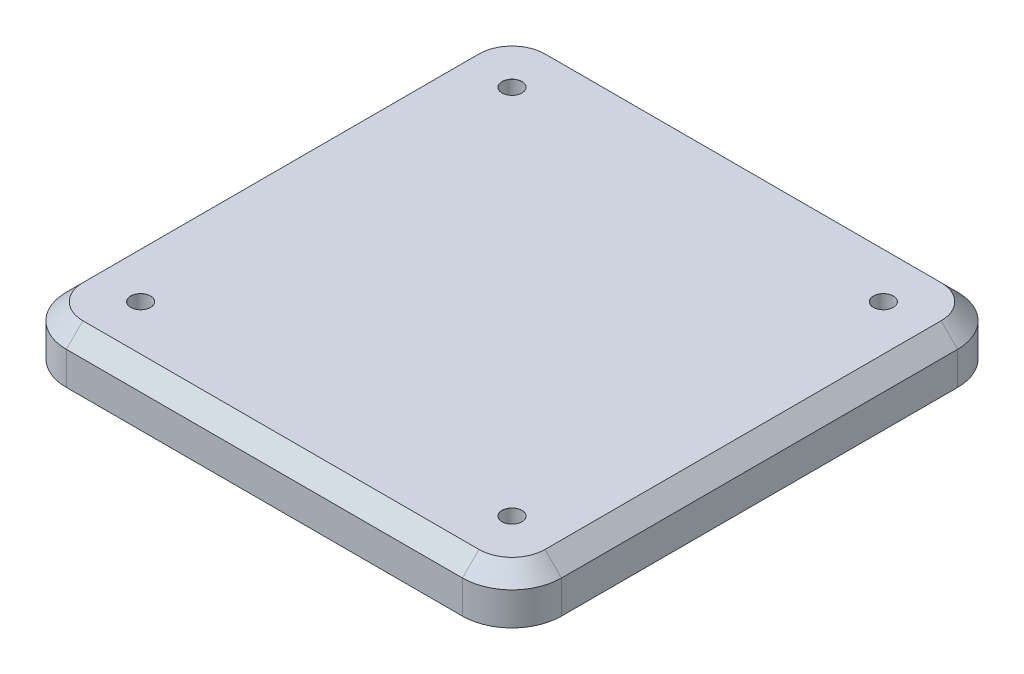
ISO-10303-21;
HEADER;
FILE_DESCRIPTION(('STEP AP214'),'2;1');
FILE_NAME('part.step','',(''),(''),'','','');
FILE_SCHEMA(('AUTOMOTIVE_DESIGN { 1 0 10303 214 1 1 1 1 }'));
ENDSEC;
DATA;
#1=APPLICATION_CONTEXT('core data for automotive mechanical design processes');
#2=APPLICATION_PROTOCOL_DEFINITION('international standard','automotive_design',2000,#1);
#3=PRODUCT_CONTEXT('',#1,'mechanical');
#4=PRODUCT('Part','Part','',(#3));
#5=PRODUCT_RELATED_PRODUCT_CATEGORY('part','',(#4));
#6=PRODUCT_DEFINITION_FORMATION('','',#4);
#7=PRODUCT_DEFINITION_CONTEXT('part definition',#1,'design');
#8=PRODUCT_DEFINITION('design','',#6,#7);
#9=PRODUCT_DEFINITION_SHAPE('','',#8);
#10=(LENGTH_UNIT() NAMED_UNIT(*) SI_UNIT(.MILLI.,.METRE.));
#11=(NAMED_UNIT(*) PLANE_ANGLE_UNIT() SI_UNIT($,.RADIAN.));
#12=(NAMED_UNIT(*) SI_UNIT($,.STERADIAN.) SOLID_ANGLE_UNIT());
#13=UNCERTAINTY_MEASURE_WITH_UNIT(LENGTH_MEASURE(1.E-05),#10,'distance_accuracy_value','');
#14=(GEOMETRIC_REPRESENTATION_CONTEXT(3) GLOBAL_UNCERTAINTY_ASSIGNED_CONTEXT((#13)) GLOBAL_UNIT_ASSIGNED_CONTEXT((#10,
#11,#12)) REPRESENTATION_CONTEXT('',''));
#15=CARTESIAN_POINT('',(0.,0.,0.));
#16=DIRECTION('',(0.,0.,1.));
#17=DIRECTION('',(1.,0.,0.));
#18=AXIS2_PLACEMENT_3D('',#15,#16,#17);
#19=CARTESIAN_POINT('',(150.,30.,-150.));
#20=DIRECTION('',(-1.,0.,0.));
#21=DIRECTION('',(0.,0.,1.));
#22=AXIS2_PLACEMENT_3D('',#19,#20,#21);
#23=PLANE('',#22);
#24=DIRECTION('',(0.,-1.,0.));
#25=VECTOR('',#24,1.);
#26=CARTESIAN_POINT('',(150.,30.,-120.));
#27=LINE('',#26,#25);
#28=CARTESIAN_POINT('',(150.,0.,-120.));
#29=VERTEX_POINT('',#28);
#30=CARTESIAN_POINT('',(150.,20.,-120.));
#31=VERTEX_POINT('',#30);
#32=EDGE_CURVE('E275',#29,#31,#27,.F.);
#33=ORIENTED_EDGE('',*,*,#32,.T.);
#34=DIRECTION('',(0.,0.,1.));
#35=VECTOR('',#34,1.);
#36=CARTESIAN_POINT('',(150.,20.,120.));
#37=LINE('',#36,#35);
#38=CARTESIAN_POINT('',(150.,20.,120.));
#39=VERTEX_POINT('',#38);
#40=EDGE_CURVE('E67',#31,#39,#37,.T.);
#41=ORIENTED_EDGE('',*,*,#40,.T.);
#42=DIRECTION('',(0.,-1.,0.));
#43=VECTOR('',#42,1.);
#44=CARTESIAN_POINT('',(150.,30.,120.));
#45=LINE('',#44,#43);
#46=CARTESIAN_POINT('',(150.,0.,120.));
#47=VERTEX_POINT('',#46);
#48=EDGE_CURVE('E278',#39,#47,#45,.T.);
#49=ORIENTED_EDGE('',*,*,#48,.T.);
#50=DIRECTION('',(0.,0.,-1.));
#51=VECTOR('',#50,1.);
#52=CARTESIAN_POINT('',(150.,0.,-150.));
#53=LINE('',#52,#51);
#54=EDGE_CURVE('E259',#47,#29,#53,.T.);
#55=ORIENTED_EDGE('',*,*,#54,.T.);
#56=EDGE_LOOP('',(#33,#41,#49,#55));
#57=FACE_BOUND('',#56,.T.);
#58=ADVANCED_FACE('F41',(#57),#23,.F.);
#59=CARTESIAN_POINT('',(-150.,30.,-150.));
#60=DIRECTION('',(0.,0.,1.));
#61=DIRECTION('',(1.,0.,0.));
#62=AXIS2_PLACEMENT_3D('',#59,#60,#61);
#63=PLANE('',#62);
#64=DIRECTION('',(0.,-1.,0.));
#65=VECTOR('',#64,1.);
#66=CARTESIAN_POINT('',(-120.,30.,-150.));
#67=LINE('',#66,#65);
#68=CARTESIAN_POINT('',(-120.,0.,-150.));
#69=VERTEX_POINT('',#68);
#70=CARTESIAN_POINT('',(-120.,20.,-150.));
#71=VERTEX_POINT('',#70);
#72=EDGE_CURVE('E309',#69,#71,#67,.F.);
#73=ORIENTED_EDGE('',*,*,#72,.T.);
#74=DIRECTION('',(1.,0.,0.));
#75=VECTOR('',#74,1.);
#76=CARTESIAN_POINT('',(120.,20.,-150.));
#77=LINE('',#76,#75);
#78=CARTESIAN_POINT('',(120.,20.,-150.));
#79=VERTEX_POINT('',#78);
#80=EDGE_CURVE('E348',#71,#79,#77,.T.);
#81=ORIENTED_EDGE('',*,*,#80,.T.);
#82=DIRECTION('',(0.,-1.,0.));
#83=VECTOR('',#82,1.);
#84=CARTESIAN_POINT('',(120.,30.,-150.));
#85=LINE('',#84,#83);
#86=CARTESIAN_POINT('',(120.,0.,-150.));
#87=VERTEX_POINT('',#86);
#88=EDGE_CURVE('E306',#79,#87,#85,.T.);
#89=ORIENTED_EDGE('',*,*,#88,.T.);
#90=DIRECTION('',(-1.,0.,0.));
#91=VECTOR('',#90,1.);
#92=CARTESIAN_POINT('',(-150.,0.,-150.));
#93=LINE('',#92,#91);
#94=EDGE_CURVE('E263',#87,#69,#93,.T.);
#95=ORIENTED_EDGE('',*,*,#94,.T.);
#96=EDGE_LOOP('',(#73,#81,#89,#95));
#97=FACE_BOUND('',#96,.T.);
#98=ADVANCED_FACE('F464',(#97),#63,.F.);
#99=CARTESIAN_POINT('',(-150.,30.,-150.));
#100=DIRECTION('',(1.,0.,0.));
#101=DIRECTION('',(0.,0.,-1.));
#102=AXIS2_PLACEMENT_3D('',#99,#100,#101);
#103=PLANE('',#102);
#104=DIRECTION('',(0.,-1.,0.));
#105=VECTOR('',#104,1.);
#106=CARTESIAN_POINT('',(-150.,30.,120.));
#107=LINE('',#106,#105);
#108=CARTESIAN_POINT('',(-150.,0.,120.));
#109=VERTEX_POINT('',#108);
#110=CARTESIAN_POINT('',(-150.,20.,120.));
#111=VERTEX_POINT('',#110);
#112=EDGE_CURVE('E299',#109,#111,#107,.F.);
#113=ORIENTED_EDGE('',*,*,#112,.T.);
#114=DIRECTION('',(0.,0.,-1.));
#115=VECTOR('',#114,1.);
#116=CARTESIAN_POINT('',(-150.,20.,-120.));
#117=LINE('',#116,#115);
#118=CARTESIAN_POINT('',(-150.,20.,-120.));
#119=VERTEX_POINT('',#118);
#120=EDGE_CURVE('E342',#111,#119,#117,.T.);
#121=ORIENTED_EDGE('',*,*,#120,.T.);
#122=DIRECTION('',(0.,-1.,0.));
#123=VECTOR('',#122,1.);
#124=CARTESIAN_POINT('',(-150.,30.,-120.));
#125=LINE('',#124,#123);
#126=CARTESIAN_POINT('',(-150.,0.,-120.));
#127=VERTEX_POINT('',#126);
#128=EDGE_CURVE('E303',#119,#127,#125,.T.);
#129=ORIENTED_EDGE('',*,*,#128,.T.);
#130=DIRECTION('',(0.,0.,1.));
#131=VECTOR('',#130,1.);
#132=CARTESIAN_POINT('',(-150.,0.,-150.));
#133=LINE('',#132,#131);
#134=EDGE_CURVE('E267',#127,#109,#133,.T.);
#135=ORIENTED_EDGE('',*,*,#134,.T.);
#136=EDGE_LOOP('',(#113,#121,#129,#135));
#137=FACE_BOUND('',#136,.T.);
#138=ADVANCED_FACE('F451',(#137),#103,.F.);
#139=CARTESIAN_POINT('',(-150.,30.,150.));
#140=DIRECTION('',(0.,0.,-1.));
#141=DIRECTION('',(-1.,0.,0.));
#142=AXIS2_PLACEMENT_3D('',#139,#140,#141);
#143=PLANE('',#142);
#144=DIRECTION('',(0.,-1.,0.));
#145=VECTOR('',#144,1.);
#146=CARTESIAN_POINT('',(120.,30.,150.));
#147=LINE('',#146,#145);
#148=CARTESIAN_POINT('',(120.,0.,150.));
#149=VERTEX_POINT('',#148);
#150=CARTESIAN_POINT('',(120.,20.,150.));
#151=VERTEX_POINT('',#150);
#152=EDGE_CURVE('E296',#149,#151,#147,.F.);
#153=ORIENTED_EDGE('',*,*,#152,.T.);
#154=DIRECTION('',(-1.,0.,0.));
#155=VECTOR('',#154,1.);
#156=CARTESIAN_POINT('',(-120.,20.,150.));
#157=LINE('',#156,#155);
#158=CARTESIAN_POINT('',(-120.,20.,150.));
#159=VERTEX_POINT('',#158);
#160=EDGE_CURVE('E11',#151,#159,#157,.T.);
#161=ORIENTED_EDGE('',*,*,#160,.T.);
#162=DIRECTION('',(0.,-1.,0.));
#163=VECTOR('',#162,1.);
#164=CARTESIAN_POINT('',(-120.,30.,150.));
#165=LINE('',#164,#163);
#166=CARTESIAN_POINT('',(-120.,0.,150.));
#167=VERTEX_POINT('',#166);
#168=EDGE_CURVE('E293',#159,#167,#165,.T.);
#169=ORIENTED_EDGE('',*,*,#168,.T.);
#170=DIRECTION('',(1.,0.,0.));
#171=VECTOR('',#170,1.);
#172=CARTESIAN_POINT('',(-150.,0.,150.));
#173=LINE('',#172,#171);
#174=EDGE_CURVE('E271',#167,#149,#173,.T.);
#175=ORIENTED_EDGE('',*,*,#174,.T.);
#176=EDGE_LOOP('',(#153,#161,#169,#175));
#177=FACE_BOUND('',#176,.T.);
#178=ADVANCED_FACE('F434',(#177),#143,.F.);
#179=CARTESIAN_POINT('',(0.,30.,0.));
#180=DIRECTION('',(0.,1.,0.));
#181=DIRECTION('',(0.,0.,1.));
#182=AXIS2_PLACEMENT_3D('',#179,#180,#181);
#183=PLANE('',#182);
#184=DIRECTION('',(0.,0.,1.));
#185=VECTOR('',#184,1.);
#186=CARTESIAN_POINT('',(-140.,30.,120.));
#187=LINE('',#186,#185);
#188=CARTESIAN_POINT('',(-140.,30.,-120.));
#189=VERTEX_POINT('',#188);
#190=CARTESIAN_POINT('',(-140.,30.,120.));
#191=VERTEX_POINT('',#190);
#192=EDGE_CURVE('E331',#189,#191,#187,.T.);
#193=ORIENTED_EDGE('',*,*,#192,.T.);
#194=CARTESIAN_POINT('',(-120.,30.,120.));
#195=DIRECTION('',(0.,1.,0.));
#196=DIRECTION('',(0.,0.,1.));
#197=AXIS2_PLACEMENT_3D('',#194,#195,#196);
#198=CIRCLE('',#197,20.);
#199=CARTESIAN_POINT('',(-120.,30.,140.));
#200=VERTEX_POINT('',#199);
#201=EDGE_CURVE('E334',#191,#200,#198,.T.);
#202=ORIENTED_EDGE('',*,*,#201,.T.);
#203=DIRECTION('',(1.,0.,0.));
#204=VECTOR('',#203,1.);
#205=CARTESIAN_POINT('',(120.,30.,140.));
#206=LINE('',#205,#204);
#207=CARTESIAN_POINT('',(120.,30.,140.));
#208=VERTEX_POINT('',#207);
#209=EDGE_CURVE('E313',#200,#208,#206,.T.);
#210=ORIENTED_EDGE('',*,*,#209,.T.);
#211=CARTESIAN_POINT('',(120.,30.,120.));
#212=DIRECTION('',(0.,1.,0.));
#213=DIRECTION('',(0.,0.,1.));
#214=AXIS2_PLACEMENT_3D('',#211,#212,#213);
#215=CIRCLE('',#214,20.);
#216=CARTESIAN_POINT('',(140.,30.,120.));
#217=VERTEX_POINT('',#216);
#218=EDGE_CURVE('E316',#208,#217,#215,.T.);
#219=ORIENTED_EDGE('',*,*,#218,.T.);
#220=DIRECTION('',(0.,0.,-1.));
#221=VECTOR('',#220,1.);
#222=CARTESIAN_POINT('',(140.,30.,-120.));
#223=LINE('',#222,#221);
#224=CARTESIAN_POINT('',(140.,30.,-120.));
#225=VERTEX_POINT('',#224);
#226=EDGE_CURVE('E319',#217,#225,#223,.T.);
#227=ORIENTED_EDGE('',*,*,#226,.T.);
#228=CARTESIAN_POINT('',(120.,30.,-120.));
#229=DIRECTION('',(0.,1.,0.));
#230=DIRECTION('',(0.,0.,1.));
#231=AXIS2_PLACEMENT_3D('',#228,#229,#230);
#232=CIRCLE('',#231,20.);
#233=CARTESIAN_POINT('',(120.,30.,-140.));
#234=VERTEX_POINT('',#233);
#235=EDGE_CURVE('E322',#225,#234,#232,.T.);
#236=ORIENTED_EDGE('',*,*,#235,.T.);
#237=DIRECTION('',(-1.,0.,0.));
#238=VECTOR('',#237,1.);
#239=CARTESIAN_POINT('',(-120.,30.,-140.));
#240=LINE('',#239,#238);
#241=CARTESIAN_POINT('',(-120.,30.,-140.));
#242=VERTEX_POINT('',#241);
#243=EDGE_CURVE('E325',#234,#242,#240,.T.);
#244=ORIENTED_EDGE('',*,*,#243,.T.);
#245=CARTESIAN_POINT('',(-120.,30.,-120.));
#246=DIRECTION('',(0.,1.,0.));
#247=DIRECTION('',(0.,0.,1.));
#248=AXIS2_PLACEMENT_3D('',#245,#246,#247);
#249=CIRCLE('',#248,20.);
#250=EDGE_CURVE('E328',#242,#189,#249,.T.);
#251=ORIENTED_EDGE('',*,*,#250,.T.);
#252=EDGE_LOOP('',(#193,#202,#210,#219,#227,#236,#244,#251));
#253=FACE_BOUND('',#252,.T.);
#254=CARTESIAN_POINT('',(-112.5,30.,-112.5));
#255=DIRECTION('',(0.,1.,0.));
#256=DIRECTION('',(0.,0.,1.));
#257=AXIS2_PLACEMENT_3D('',#254,#255,#256);
#258=CIRCLE('',#257,6.025);
#259=CARTESIAN_POINT('',(-112.5,30.,-106.475));
#260=VERTEX_POINT('',#259);
#261=EDGE_CURVE('E211',#260,#260,#258,.T.);
#262=ORIENTED_EDGE('',*,*,#261,.F.);
#263=EDGE_LOOP('',(#262));
#264=FACE_BOUND('',#263,.T.);
#265=CARTESIAN_POINT('',(112.5,30.,-112.5));
#266=DIRECTION('',(0.,1.,0.));
#267=DIRECTION('',(0.,0.,1.));
#268=AXIS2_PLACEMENT_3D('',#265,#266,#267);
#269=CIRCLE('',#268,6.025);
#270=CARTESIAN_POINT('',(112.5,30.,-106.475));
#271=VERTEX_POINT('',#270);
#272=EDGE_CURVE('E223',#271,#271,#269,.T.);
#273=ORIENTED_EDGE('',*,*,#272,.F.);
#274=EDGE_LOOP('',(#273));
#275=FACE_BOUND('',#274,.T.);
#276=CARTESIAN_POINT('',(112.5,30.,112.5));
#277=DIRECTION('',(0.,1.,0.));
#278=DIRECTION('',(0.,0.,1.));
#279=AXIS2_PLACEMENT_3D('',#276,#277,#278);
#280=CIRCLE('',#279,6.025);
#281=CARTESIAN_POINT('',(112.5,30.,118.525));
#282=VERTEX_POINT('',#281);
#283=EDGE_CURVE('E235',#282,#282,#280,.T.);
#284=ORIENTED_EDGE('',*,*,#283,.F.);
#285=EDGE_LOOP('',(#284));
#286=FACE_BOUND('',#285,.T.);
#287=CARTESIAN_POINT('',(-112.5,30.,112.5));
#288=DIRECTION('',(0.,1.,0.));
#289=DIRECTION('',(0.,0.,1.));
#290=AXIS2_PLACEMENT_3D('',#287,#288,#289);
#291=CIRCLE('',#290,6.025);
#292=CARTESIAN_POINT('',(-112.5,30.,118.525));
#293=VERTEX_POINT('',#292);
#294=EDGE_CURVE('E247',#293,#293,#291,.T.);
#295=ORIENTED_EDGE('',*,*,#294,.F.);
#296=EDGE_LOOP('',(#295));
#297=FACE_BOUND('',#296,.T.);
#298=ADVANCED_FACE('F401',(#253,#264,#275,#286,#297),#183,.T.);
#299=CARTESIAN_POINT('',(0.,0.,0.));
#300=DIRECTION('',(0.,1.,0.));
#301=DIRECTION('',(0.,0.,1.));
#302=AXIS2_PLACEMENT_3D('',#299,#300,#301);
#303=PLANE('',#302);
#304=CARTESIAN_POINT('',(125.,0.,-125.));
#305=DIRECTION('',(0.,-1.,0.));
#306=DIRECTION('',(0.,0.,-1.));
#307=AXIS2_PLACEMENT_3D('',#304,#305,#306);
#308=CIRCLE('',#307,6.025);
#309=CARTESIAN_POINT('',(125.,0.,-131.025));
#310=VERTEX_POINT('',#309);
#311=EDGE_CURVE('E176',#310,#310,#308,.T.);
#312=ORIENTED_EDGE('',*,*,#311,.F.);
#313=EDGE_LOOP('',(#312));
#314=FACE_BOUND('',#313,.T.);
#315=CARTESIAN_POINT('',(-125.,0.,-125.));
#316=DIRECTION('',(0.,-1.,0.));
#317=DIRECTION('',(0.,0.,-1.));
#318=AXIS2_PLACEMENT_3D('',#315,#316,#317);
#319=CIRCLE('',#318,6.025);
#320=CARTESIAN_POINT('',(-125.,0.,-131.025));
#321=VERTEX_POINT('',#320);
#322=EDGE_CURVE('E167',#321,#321,#319,.T.);
#323=ORIENTED_EDGE('',*,*,#322,.F.);
#324=EDGE_LOOP('',(#323));
#325=FACE_BOUND('',#324,.T.);
#326=CARTESIAN_POINT('',(-125.,0.,125.));
#327=DIRECTION('',(0.,-1.,0.));
#328=DIRECTION('',(0.,0.,-1.));
#329=AXIS2_PLACEMENT_3D('',#326,#327,#328);
#330=CIRCLE('',#329,6.025);
#331=CARTESIAN_POINT('',(-125.,0.,118.975));
#332=VERTEX_POINT('',#331);
#333=EDGE_CURVE('E187',#332,#332,#330,.T.);
#334=ORIENTED_EDGE('',*,*,#333,.F.);
#335=EDGE_LOOP('',(#334));
#336=FACE_BOUND('',#335,.T.);
#337=CARTESIAN_POINT('',(125.,0.,125.));
#338=DIRECTION('',(0.,-1.,0.));
#339=DIRECTION('',(0.,0.,-1.));
#340=AXIS2_PLACEMENT_3D('',#337,#338,#339);
#341=CIRCLE('',#340,6.025);
#342=CARTESIAN_POINT('',(125.,0.,118.975));
#343=VERTEX_POINT('',#342);
#344=EDGE_CURVE('E199',#343,#343,#341,.T.);
#345=ORIENTED_EDGE('',*,*,#344,.F.);
#346=EDGE_LOOP('',(#345));
#347=FACE_BOUND('',#346,.T.);
#348=ORIENTED_EDGE('',*,*,#54,.F.);
#349=CARTESIAN_POINT('',(120.,0.,120.));
#350=DIRECTION('',(0.,1.,0.));
#351=DIRECTION('',(0.,0.,1.));
#352=AXIS2_PLACEMENT_3D('',#349,#350,#351);
#353=CIRCLE('',#352,30.);
#354=EDGE_CURVE('E290',#47,#149,#353,.F.);
#355=ORIENTED_EDGE('',*,*,#354,.T.);
#356=ORIENTED_EDGE('',*,*,#174,.F.);
#357=CARTESIAN_POINT('',(-120.,0.,120.));
#358=DIRECTION('',(0.,1.,0.));
#359=DIRECTION('',(0.,0.,1.));
#360=AXIS2_PLACEMENT_3D('',#357,#358,#359);
#361=CIRCLE('',#360,30.);
#362=EDGE_CURVE('E281',#167,#109,#361,.F.);
#363=ORIENTED_EDGE('',*,*,#362,.T.);
#364=ORIENTED_EDGE('',*,*,#134,.F.);
#365=CARTESIAN_POINT('',(-120.,0.,-120.));
#366=DIRECTION('',(0.,1.,0.));
#367=DIRECTION('',(0.,0.,1.));
#368=AXIS2_PLACEMENT_3D('',#365,#366,#367);
#369=CIRCLE('',#368,30.);
#370=EDGE_CURVE('E287',#127,#69,#369,.F.);
#371=ORIENTED_EDGE('',*,*,#370,.T.);
#372=ORIENTED_EDGE('',*,*,#94,.F.);
#373=CARTESIAN_POINT('',(120.,0.,-120.));
#374=DIRECTION('',(0.,1.,0.));
#375=DIRECTION('',(0.,0.,1.));
#376=AXIS2_PLACEMENT_3D('',#373,#374,#375);
#377=CIRCLE('',#376,30.);
#378=EDGE_CURVE('E284',#87,#29,#377,.F.);
#379=ORIENTED_EDGE('',*,*,#378,.T.);
#380=EDGE_LOOP('',(#348,#355,#356,#363,#364,#371,#372,#379));
#381=FACE_BOUND('',#380,.T.);
#382=ADVANCED_FACE('F397',(#314,#325,#336,#347,#381),#303,.F.);
#383=CARTESIAN_POINT('',(-112.5,20.,112.5));
#384=DIRECTION('',(0.,1.,0.));
#385=DIRECTION('',(0.,0.,1.));
#386=AXIS2_PLACEMENT_3D('',#383,#384,#385);
#387=CONICAL_SURFACE('',#386,6.00000000000001,1.02974425867666);
#388=CARTESIAN_POINT('',(-112.5,16.3948362858346,112.5));
#389=VERTEX_POINT('',#388);
#390=VERTEX_LOOP('',#389);
#391=FACE_BOUND('',#390,.T.);
#392=CARTESIAN_POINT('',(-112.5,20.,112.5));
#393=DIRECTION('',(0.,1.,0.));
#394=DIRECTION('',(0.,0.,1.));
#395=AXIS2_PLACEMENT_3D('',#392,#393,#394);
#396=CIRCLE('',#395,6.00000000000001);
#397=CARTESIAN_POINT('',(-112.5,20.,118.5));
#398=VERTEX_POINT('',#397);
#399=EDGE_CURVE('E255',#398,#398,#396,.T.);
#400=ORIENTED_EDGE('',*,*,#399,.T.);
#401=EDGE_LOOP('',(#400));
#402=FACE_BOUND('',#401,.T.);
#403=ADVANCED_FACE('F400',(#391,#402),#387,.F.);
#404=CARTESIAN_POINT('',(-112.5,30.,112.5));
#405=DIRECTION('',(0.,1.,0.));
#406=DIRECTION('',(0.,0.,1.));
#407=AXIS2_PLACEMENT_3D('',#404,#405,#406);
#408=CYLINDRICAL_SURFACE('',#407,6.00000000000001);
#409=ORIENTED_EDGE('',*,*,#399,.F.);
#410=EDGE_LOOP('',(#409));
#411=FACE_BOUND('',#410,.T.);
#412=CARTESIAN_POINT('',(-112.5,29.975,112.5));
#413=DIRECTION('',(0.,1.,0.));
#414=DIRECTION('',(0.,0.,1.));
#415=AXIS2_PLACEMENT_3D('',#412,#413,#414);
#416=CIRCLE('',#415,6.00000000000001);
#417=CARTESIAN_POINT('',(-112.5,29.975,118.5));
#418=VERTEX_POINT('',#417);
#419=EDGE_CURVE('E251',#418,#418,#416,.T.);
#420=ORIENTED_EDGE('',*,*,#419,.T.);
#421=EDGE_LOOP('',(#420));
#422=FACE_BOUND('',#421,.T.);
#423=ADVANCED_FACE('F491',(#411,#422),#408,.F.);
#424=CARTESIAN_POINT('',(-112.5,30.,112.5));
#425=DIRECTION('',(0.,1.,0.));
#426=DIRECTION('',(0.,0.,1.));
#427=AXIS2_PLACEMENT_3D('',#424,#425,#426);
#428=CONICAL_SURFACE('',#427,6.025,0.785398163397379);
#429=ORIENTED_EDGE('',*,*,#419,.F.);
#430=EDGE_LOOP('',(#429));
#431=FACE_BOUND('',#430,.T.);
#432=ORIENTED_EDGE('',*,*,#294,.T.);
#433=EDGE_LOOP('',(#432));
#434=FACE_BOUND('',#433,.T.);
#435=ADVANCED_FACE('F495',(#431,#434),#428,.F.);
#436=CARTESIAN_POINT('',(112.5,20.,112.5));
#437=DIRECTION('',(0.,1.,0.));
#438=DIRECTION('',(0.,0.,1.));
#439=AXIS2_PLACEMENT_3D('',#436,#437,#438);
#440=CONICAL_SURFACE('',#439,6.00000000000001,1.02974425867666);
#441=CARTESIAN_POINT('',(112.5,16.3948362858346,112.5));
#442=VERTEX_POINT('',#441);
#443=VERTEX_LOOP('',#442);
#444=FACE_BOUND('',#443,.T.);
#445=CARTESIAN_POINT('',(112.5,20.,112.5));
#446=DIRECTION('',(0.,1.,0.));
#447=DIRECTION('',(0.,0.,1.));
#448=AXIS2_PLACEMENT_3D('',#445,#446,#447);
#449=CIRCLE('',#448,6.00000000000001);
#450=CARTESIAN_POINT('',(112.5,20.,118.5));
#451=VERTEX_POINT('',#450);
#452=EDGE_CURVE('E243',#451,#451,#449,.T.);
#453=ORIENTED_EDGE('',*,*,#452,.T.);
#454=EDGE_LOOP('',(#453));
#455=FACE_BOUND('',#454,.T.);
#456=ADVANCED_FACE('F499',(#444,#455),#440,.F.);
#457=CARTESIAN_POINT('',(112.5,30.,112.5));
#458=DIRECTION('',(0.,1.,0.));
#459=DIRECTION('',(0.,0.,1.));
#460=AXIS2_PLACEMENT_3D('',#457,#458,#459);
#461=CYLINDRICAL_SURFACE('',#460,6.00000000000001);
#462=ORIENTED_EDGE('',*,*,#452,.F.);
#463=EDGE_LOOP('',(#462));
#464=FACE_BOUND('',#463,.T.);
#465=CARTESIAN_POINT('',(112.5,29.975,112.5));
#466=DIRECTION('',(0.,1.,0.));
#467=DIRECTION('',(0.,0.,1.));
#468=AXIS2_PLACEMENT_3D('',#465,#466,#467);
#469=CIRCLE('',#468,6.00000000000001);
#470=CARTESIAN_POINT('',(112.5,29.975,118.5));
#471=VERTEX_POINT('',#470);
#472=EDGE_CURVE('E239',#471,#471,#469,.T.);
#473=ORIENTED_EDGE('',*,*,#472,.T.);
#474=EDGE_LOOP('',(#473));
#475=FACE_BOUND('',#474,.T.);
#476=ADVANCED_FACE('F503',(#464,#475),#461,.F.);
#477=CARTESIAN_POINT('',(112.5,30.,112.5));
#478=DIRECTION('',(0.,1.,0.));
#479=DIRECTION('',(0.,0.,1.));
#480=AXIS2_PLACEMENT_3D('',#477,#478,#479);
#481=CONICAL_SURFACE('',#480,6.025,0.785398163397379);
#482=ORIENTED_EDGE('',*,*,#472,.F.);
#483=EDGE_LOOP('',(#482));
#484=FACE_BOUND('',#483,.T.);
#485=ORIENTED_EDGE('',*,*,#283,.T.);
#486=EDGE_LOOP('',(#485));
#487=FACE_BOUND('',#486,.T.);
#488=ADVANCED_FACE('F507',(#484,#487),#481,.F.);
#489=CARTESIAN_POINT('',(112.5,20.,-112.5));
#490=DIRECTION('',(0.,1.,0.));
#491=DIRECTION('',(0.,0.,1.));
#492=AXIS2_PLACEMENT_3D('',#489,#490,#491);
#493=CONICAL_SURFACE('',#492,6.00000000000001,1.02974425867666);
#494=CARTESIAN_POINT('',(112.5,16.3948362858346,-112.5));
#495=VERTEX_POINT('',#494);
#496=VERTEX_LOOP('',#495);
#497=FACE_BOUND('',#496,.T.);
#498=CARTESIAN_POINT('',(112.5,20.,-112.5));
#499=DIRECTION('',(0.,1.,0.));
#500=DIRECTION('',(0.,0.,1.));
#501=AXIS2_PLACEMENT_3D('',#498,#499,#500);
#502=CIRCLE('',#501,6.00000000000001);
#503=CARTESIAN_POINT('',(112.5,20.,-106.5));
#504=VERTEX_POINT('',#503);
#505=EDGE_CURVE('E231',#504,#504,#502,.T.);
#506=ORIENTED_EDGE('',*,*,#505,.T.);
#507=EDGE_LOOP('',(#506));
#508=FACE_BOUND('',#507,.T.);
#509=ADVANCED_FACE('F511',(#497,#508),#493,.F.);
#510=CARTESIAN_POINT('',(112.5,30.,-112.5));
#511=DIRECTION('',(0.,1.,0.));
#512=DIRECTION('',(0.,0.,1.));
#513=AXIS2_PLACEMENT_3D('',#510,#511,#512);
#514=CYLINDRICAL_SURFACE('',#513,6.00000000000001);
#515=ORIENTED_EDGE('',*,*,#505,.F.);
#516=EDGE_LOOP('',(#515));
#517=FACE_BOUND('',#516,.T.);
#518=CARTESIAN_POINT('',(112.5,29.975,-112.5));
#519=DIRECTION('',(0.,1.,0.));
#520=DIRECTION('',(0.,0.,1.));
#521=AXIS2_PLACEMENT_3D('',#518,#519,#520);
#522=CIRCLE('',#521,6.00000000000001);
#523=CARTESIAN_POINT('',(112.5,29.975,-106.5));
#524=VERTEX_POINT('',#523);
#525=EDGE_CURVE('E227',#524,#524,#522,.T.);
#526=ORIENTED_EDGE('',*,*,#525,.T.);
#527=EDGE_LOOP('',(#526));
#528=FACE_BOUND('',#527,.T.);
#529=ADVANCED_FACE('F515',(#517,#528),#514,.F.);
#530=CARTESIAN_POINT('',(112.5,30.,-112.5));
#531=DIRECTION('',(0.,1.,0.));
#532=DIRECTION('',(0.,0.,1.));
#533=AXIS2_PLACEMENT_3D('',#530,#531,#532);
#534=CONICAL_SURFACE('',#533,6.025,0.785398163397379);
#535=ORIENTED_EDGE('',*,*,#525,.F.);
#536=EDGE_LOOP('',(#535));
#537=FACE_BOUND('',#536,.T.);
#538=ORIENTED_EDGE('',*,*,#272,.T.);
#539=EDGE_LOOP('',(#538));
#540=FACE_BOUND('',#539,.T.);
#541=ADVANCED_FACE('F519',(#537,#540),#534,.F.);
#542=CARTESIAN_POINT('',(-112.5,20.,-112.5));
#543=DIRECTION('',(0.,1.,0.));
#544=DIRECTION('',(0.,0.,1.));
#545=AXIS2_PLACEMENT_3D('',#542,#543,#544);
#546=CONICAL_SURFACE('',#545,6.00000000000001,1.02974425867666);
#547=CARTESIAN_POINT('',(-112.5,16.3948362858346,-112.5));
#548=VERTEX_POINT('',#547);
#549=VERTEX_LOOP('',#548);
#550=FACE_BOUND('',#549,.T.);
#551=CARTESIAN_POINT('',(-112.5,20.,-112.5));
#552=DIRECTION('',(0.,1.,0.));
#553=DIRECTION('',(0.,0.,1.));
#554=AXIS2_PLACEMENT_3D('',#551,#552,#553);
#555=CIRCLE('',#554,6.00000000000001);
#556=CARTESIAN_POINT('',(-112.5,20.,-106.5));
#557=VERTEX_POINT('',#556);
#558=EDGE_CURVE('E219',#557,#557,#555,.T.);
#559=ORIENTED_EDGE('',*,*,#558,.T.);
#560=EDGE_LOOP('',(#559));
#561=FACE_BOUND('',#560,.T.);
#562=ADVANCED_FACE('F523',(#550,#561),#546,.F.);
#563=CARTESIAN_POINT('',(-112.5,30.,-112.5));
#564=DIRECTION('',(0.,1.,0.));
#565=DIRECTION('',(0.,0.,1.));
#566=AXIS2_PLACEMENT_3D('',#563,#564,#565);
#567=CYLINDRICAL_SURFACE('',#566,6.00000000000001);
#568=ORIENTED_EDGE('',*,*,#558,.F.);
#569=EDGE_LOOP('',(#568));
#570=FACE_BOUND('',#569,.T.);
#571=CARTESIAN_POINT('',(-112.5,29.975,-112.5));
#572=DIRECTION('',(0.,1.,0.));
#573=DIRECTION('',(0.,0.,1.));
#574=AXIS2_PLACEMENT_3D('',#571,#572,#573);
#575=CIRCLE('',#574,6.00000000000001);
#576=CARTESIAN_POINT('',(-112.5,29.975,-106.5));
#577=VERTEX_POINT('',#576);
#578=EDGE_CURVE('E215',#577,#577,#575,.T.);
#579=ORIENTED_EDGE('',*,*,#578,.T.);
#580=EDGE_LOOP('',(#579));
#581=FACE_BOUND('',#580,.T.);
#582=ADVANCED_FACE('F527',(#570,#581),#567,.F.);
#583=CARTESIAN_POINT('',(-112.5,30.,-112.5));
#584=DIRECTION('',(0.,1.,0.));
#585=DIRECTION('',(0.,0.,1.));
#586=AXIS2_PLACEMENT_3D('',#583,#584,#585);
#587=CONICAL_SURFACE('',#586,6.025,0.785398163397379);
#588=ORIENTED_EDGE('',*,*,#578,.F.);
#589=EDGE_LOOP('',(#588));
#590=FACE_BOUND('',#589,.T.);
#591=ORIENTED_EDGE('',*,*,#261,.T.);
#592=EDGE_LOOP('',(#591));
#593=FACE_BOUND('',#592,.T.);
#594=ADVANCED_FACE('F531',(#590,#593),#587,.F.);
#595=CARTESIAN_POINT('',(125.,9.99999999999999,125.));
#596=DIRECTION('',(0.,-1.,0.));
#597=DIRECTION('',(0.,0.,-1.));
#598=AXIS2_PLACEMENT_3D('',#595,#596,#597);
#599=CONICAL_SURFACE('',#598,5.99999999999998,1.02974425867665);
#600=CARTESIAN_POINT('',(125.,13.6051637141654,125.));
#601=VERTEX_POINT('',#600);
#602=VERTEX_LOOP('',#601);
#603=FACE_BOUND('',#602,.T.);
#604=CARTESIAN_POINT('',(125.,9.99999999999999,125.));
#605=DIRECTION('',(0.,-1.,0.));
#606=DIRECTION('',(0.,0.,-1.));
#607=AXIS2_PLACEMENT_3D('',#604,#605,#606);
#608=CIRCLE('',#607,5.99999999999998);
#609=CARTESIAN_POINT('',(125.,9.99999999999999,119.));
#610=VERTEX_POINT('',#609);
#611=EDGE_CURVE('E207',#610,#610,#608,.T.);
#612=ORIENTED_EDGE('',*,*,#611,.T.);
#613=EDGE_LOOP('',(#612));
#614=FACE_BOUND('',#613,.T.);
#615=ADVANCED_FACE('F535',(#603,#614),#599,.F.);
#616=CARTESIAN_POINT('',(125.,0.,125.));
#617=DIRECTION('',(0.,-1.,0.));
#618=DIRECTION('',(0.,0.,-1.));
#619=AXIS2_PLACEMENT_3D('',#616,#617,#618);
#620=CYLINDRICAL_SURFACE('',#619,5.99999999999998);
#621=ORIENTED_EDGE('',*,*,#611,.F.);
#622=EDGE_LOOP('',(#621));
#623=FACE_BOUND('',#622,.T.);
#624=CARTESIAN_POINT('',(125.,0.0250000000000111,125.));
#625=DIRECTION('',(0.,-1.,0.));
#626=DIRECTION('',(0.,0.,-1.));
#627=AXIS2_PLACEMENT_3D('',#624,#625,#626);
#628=CIRCLE('',#627,5.99999999999998);
#629=CARTESIAN_POINT('',(125.,0.0250000000000111,119.));
#630=VERTEX_POINT('',#629);
#631=EDGE_CURVE('E203',#630,#630,#628,.T.);
#632=ORIENTED_EDGE('',*,*,#631,.T.);
#633=EDGE_LOOP('',(#632));
#634=FACE_BOUND('',#633,.T.);
#635=ADVANCED_FACE('F539',(#623,#634),#620,.F.);
#636=CARTESIAN_POINT('',(125.,0.,125.));
#637=DIRECTION('',(0.,-1.,0.));
#638=DIRECTION('',(0.,0.,-1.));
#639=AXIS2_PLACEMENT_3D('',#636,#637,#638);
#640=CONICAL_SURFACE('',#639,6.025,0.785398163397709);
#641=ORIENTED_EDGE('',*,*,#631,.F.);
#642=EDGE_LOOP('',(#641));
#643=FACE_BOUND('',#642,.T.);
#644=ORIENTED_EDGE('',*,*,#344,.T.);
#645=EDGE_LOOP('',(#644));
#646=FACE_BOUND('',#645,.T.);
#647=ADVANCED_FACE('F543',(#643,#646),#640,.F.);
#648=CARTESIAN_POINT('',(-125.,9.99999999999999,125.));
#649=DIRECTION('',(0.,-1.,0.));
#650=DIRECTION('',(0.,0.,-1.));
#651=AXIS2_PLACEMENT_3D('',#648,#649,#650);
#652=CONICAL_SURFACE('',#651,5.99999999999999,1.02974425867665);
#653=CARTESIAN_POINT('',(-125.,13.6051637141654,125.));
#654=VERTEX_POINT('',#653);
#655=VERTEX_LOOP('',#654);
#656=FACE_BOUND('',#655,.T.);
#657=CARTESIAN_POINT('',(-125.,9.99999999999999,125.));
#658=DIRECTION('',(0.,-1.,0.));
#659=DIRECTION('',(0.,0.,-1.));
#660=AXIS2_PLACEMENT_3D('',#657,#658,#659);
#661=CIRCLE('',#660,5.99999999999999);
#662=CARTESIAN_POINT('',(-125.,9.99999999999999,119.));
#663=VERTEX_POINT('',#662);
#664=EDGE_CURVE('E195',#663,#663,#661,.T.);
#665=ORIENTED_EDGE('',*,*,#664,.T.);
#666=EDGE_LOOP('',(#665));
#667=FACE_BOUND('',#666,.T.);
#668=ADVANCED_FACE('F547',(#656,#667),#652,.F.);
#669=CARTESIAN_POINT('',(-125.,0.,125.));
#670=DIRECTION('',(0.,-1.,0.));
#671=DIRECTION('',(0.,0.,-1.));
#672=AXIS2_PLACEMENT_3D('',#669,#670,#671);
#673=CYLINDRICAL_SURFACE('',#672,5.99999999999999);
#674=ORIENTED_EDGE('',*,*,#664,.F.);
#675=EDGE_LOOP('',(#674));
#676=FACE_BOUND('',#675,.T.);
#677=CARTESIAN_POINT('',(-125.,0.0250000000000111,125.));
#678=DIRECTION('',(0.,-1.,0.));
#679=DIRECTION('',(0.,0.,-1.));
#680=AXIS2_PLACEMENT_3D('',#677,#678,#679);
#681=CIRCLE('',#680,5.99999999999999);
#682=CARTESIAN_POINT('',(-125.,0.0250000000000111,119.));
#683=VERTEX_POINT('',#682);
#684=EDGE_CURVE('E191',#683,#683,#681,.T.);
#685=ORIENTED_EDGE('',*,*,#684,.T.);
#686=EDGE_LOOP('',(#685));
#687=FACE_BOUND('',#686,.T.);
#688=ADVANCED_FACE('F551',(#676,#687),#673,.F.);
#689=CARTESIAN_POINT('',(-125.,0.,125.));
#690=DIRECTION('',(0.,-1.,0.));
#691=DIRECTION('',(0.,0.,-1.));
#692=AXIS2_PLACEMENT_3D('',#689,#690,#691);
#693=CONICAL_SURFACE('',#692,6.025,0.785398163397431);
#694=ORIENTED_EDGE('',*,*,#684,.F.);
#695=EDGE_LOOP('',(#694));
#696=FACE_BOUND('',#695,.T.);
#697=ORIENTED_EDGE('',*,*,#333,.T.);
#698=EDGE_LOOP('',(#697));
#699=FACE_BOUND('',#698,.T.);
#700=ADVANCED_FACE('F555',(#696,#699),#693,.F.);
#701=CARTESIAN_POINT('',(-125.,9.99999999999999,-125.));
#702=DIRECTION('',(0.,-1.,0.));
#703=DIRECTION('',(0.,0.,-1.));
#704=AXIS2_PLACEMENT_3D('',#701,#702,#703);
#705=CONICAL_SURFACE('',#704,5.99999999999999,1.02974425867665);
#706=CARTESIAN_POINT('',(-125.,13.6051637141654,-125.));
#707=VERTEX_POINT('',#706);
#708=VERTEX_LOOP('',#707);
#709=FACE_BOUND('',#708,.T.);
#710=CARTESIAN_POINT('',(-125.,9.99999999999999,-125.));
#711=DIRECTION('',(0.,-1.,0.));
#712=DIRECTION('',(0.,0.,-1.));
#713=AXIS2_PLACEMENT_3D('',#710,#711,#712);
#714=CIRCLE('',#713,5.99999999999999);
#715=CARTESIAN_POINT('',(-125.,9.99999999999999,-131.));
#716=VERTEX_POINT('',#715);
#717=EDGE_CURVE('E183',#716,#716,#714,.T.);
#718=ORIENTED_EDGE('',*,*,#717,.T.);
#719=EDGE_LOOP('',(#718));
#720=FACE_BOUND('',#719,.T.);
#721=ADVANCED_FACE('F559',(#709,#720),#705,.F.);
#722=CARTESIAN_POINT('',(-125.,0.,-125.));
#723=DIRECTION('',(0.,-1.,0.));
#724=DIRECTION('',(0.,0.,-1.));
#725=AXIS2_PLACEMENT_3D('',#722,#723,#724);
#726=CYLINDRICAL_SURFACE('',#725,5.99999999999999);
#727=ORIENTED_EDGE('',*,*,#717,.F.);
#728=EDGE_LOOP('',(#727));
#729=FACE_BOUND('',#728,.T.);
#730=CARTESIAN_POINT('',(-125.,0.0250000000000111,-125.));
#731=DIRECTION('',(0.,-1.,0.));
#732=DIRECTION('',(0.,0.,-1.));
#733=AXIS2_PLACEMENT_3D('',#730,#731,#732);
#734=CIRCLE('',#733,5.99999999999999);
#735=CARTESIAN_POINT('',(-125.,0.0250000000000111,-131.));
#736=VERTEX_POINT('',#735);
#737=EDGE_CURVE('E173',#736,#736,#734,.T.);
#738=ORIENTED_EDGE('',*,*,#737,.T.);
#739=EDGE_LOOP('',(#738));
#740=FACE_BOUND('',#739,.T.);
#741=ADVANCED_FACE('F563',(#729,#740),#726,.F.);
#742=CARTESIAN_POINT('',(-125.,0.,-125.));
#743=DIRECTION('',(0.,-1.,0.));
#744=DIRECTION('',(0.,0.,-1.));
#745=AXIS2_PLACEMENT_3D('',#742,#743,#744);
#746=CONICAL_SURFACE('',#745,6.025,0.785398163397431);
#747=ORIENTED_EDGE('',*,*,#737,.F.);
#748=EDGE_LOOP('',(#747));
#749=FACE_BOUND('',#748,.T.);
#750=ORIENTED_EDGE('',*,*,#322,.T.);
#751=EDGE_LOOP('',(#750));
#752=FACE_BOUND('',#751,.T.);
#753=ADVANCED_FACE('F160',(#749,#752),#746,.F.);
#754=CARTESIAN_POINT('',(125.,9.99999999999999,-125.));
#755=DIRECTION('',(0.,-1.,0.));
#756=DIRECTION('',(0.,0.,-1.));
#757=AXIS2_PLACEMENT_3D('',#754,#755,#756);
#758=CONICAL_SURFACE('',#757,5.99999999999998,1.02974425867665);
#759=CARTESIAN_POINT('',(125.,13.6051637141654,-125.));
#760=VERTEX_POINT('',#759);
#761=VERTEX_LOOP('',#760);
#762=FACE_BOUND('',#761,.T.);
#763=CARTESIAN_POINT('',(125.,9.99999999999999,-125.));
#764=DIRECTION('',(0.,-1.,0.));
#765=DIRECTION('',(0.,0.,-1.));
#766=AXIS2_PLACEMENT_3D('',#763,#764,#765);
#767=CIRCLE('',#766,5.99999999999998);
#768=CARTESIAN_POINT('',(125.,9.99999999999999,-131.));
#769=VERTEX_POINT('',#768);
#770=EDGE_CURVE('E164',#769,#769,#767,.T.);
#771=ORIENTED_EDGE('',*,*,#770,.T.);
#772=EDGE_LOOP('',(#771));
#773=FACE_BOUND('',#772,.T.);
#774=ADVANCED_FACE('F156',(#762,#773),#758,.F.);
#775=CARTESIAN_POINT('',(125.,0.,-125.));
#776=DIRECTION('',(0.,-1.,0.));
#777=DIRECTION('',(0.,0.,-1.));
#778=AXIS2_PLACEMENT_3D('',#775,#776,#777);
#779=CYLINDRICAL_SURFACE('',#778,5.99999999999998);
#780=ORIENTED_EDGE('',*,*,#770,.F.);
#781=EDGE_LOOP('',(#780));
#782=FACE_BOUND('',#781,.T.);
#783=CARTESIAN_POINT('',(125.,0.0250000000000111,-125.));
#784=DIRECTION('',(0.,-1.,0.));
#785=DIRECTION('',(0.,0.,-1.));
#786=AXIS2_PLACEMENT_3D('',#783,#784,#785);
#787=CIRCLE('',#786,5.99999999999998);
#788=CARTESIAN_POINT('',(125.,0.0250000000000111,-131.));
#789=VERTEX_POINT('',#788);
#790=EDGE_CURVE('E168',#789,#789,#787,.T.);
#791=ORIENTED_EDGE('',*,*,#790,.T.);
#792=EDGE_LOOP('',(#791));
#793=FACE_BOUND('',#792,.T.);
#794=ADVANCED_FACE('F159',(#782,#793),#779,.F.);
#795=CARTESIAN_POINT('',(125.,0.,-125.));
#796=DIRECTION('',(0.,-1.,0.));
#797=DIRECTION('',(0.,0.,-1.));
#798=AXIS2_PLACEMENT_3D('',#795,#796,#797);
#799=CONICAL_SURFACE('',#798,6.025,0.785398163397709);
#800=ORIENTED_EDGE('',*,*,#790,.F.);
#801=EDGE_LOOP('',(#800));
#802=FACE_BOUND('',#801,.T.);
#803=ORIENTED_EDGE('',*,*,#311,.T.);
#804=EDGE_LOOP('',(#803));
#805=FACE_BOUND('',#804,.T.);
#806=ADVANCED_FACE('F395',(#802,#805),#799,.F.);
#807=CARTESIAN_POINT('',(120.,30.,120.));
#808=DIRECTION('',(0.,-1.,0.));
#809=DIRECTION('',(0.,0.,-1.));
#810=AXIS2_PLACEMENT_3D('',#807,#808,#809);
#811=CYLINDRICAL_SURFACE('',#810,30.);
#812=ORIENTED_EDGE('',*,*,#48,.F.);
#813=CARTESIAN_POINT('',(120.,20.,120.));
#814=DIRECTION('',(0.,1.,0.));
#815=DIRECTION('',(0.,0.,1.));
#816=AXIS2_PLACEMENT_3D('',#813,#814,#815);
#817=CIRCLE('',#816,30.);
#818=EDGE_CURVE('E52',#39,#151,#817,.F.);
#819=ORIENTED_EDGE('',*,*,#818,.T.);
#820=ORIENTED_EDGE('',*,*,#152,.F.);
#821=ORIENTED_EDGE('',*,*,#354,.F.);
#822=EDGE_LOOP('',(#812,#819,#820,#821));
#823=FACE_BOUND('',#822,.T.);
#824=ADVANCED_FACE('F465',(#823),#811,.T.);
#825=CARTESIAN_POINT('',(-120.,30.,-120.));
#826=DIRECTION('',(0.,-1.,0.));
#827=DIRECTION('',(0.,0.,-1.));
#828=AXIS2_PLACEMENT_3D('',#825,#826,#827);
#829=CYLINDRICAL_SURFACE('',#828,30.);
#830=ORIENTED_EDGE('',*,*,#128,.F.);
#831=CARTESIAN_POINT('',(-120.,20.,-120.));
#832=DIRECTION('',(0.,1.,0.));
#833=DIRECTION('',(0.,0.,1.));
#834=AXIS2_PLACEMENT_3D('',#831,#832,#833);
#835=CIRCLE('',#834,30.);
#836=EDGE_CURVE('E345',#119,#71,#835,.F.);
#837=ORIENTED_EDGE('',*,*,#836,.T.);
#838=ORIENTED_EDGE('',*,*,#72,.F.);
#839=ORIENTED_EDGE('',*,*,#370,.F.);
#840=EDGE_LOOP('',(#830,#837,#838,#839));
#841=FACE_BOUND('',#840,.T.);
#842=ADVANCED_FACE('F455',(#841),#829,.T.);
#843=CARTESIAN_POINT('',(120.,30.,-120.));
#844=DIRECTION('',(0.,-1.,0.));
#845=DIRECTION('',(0.,0.,-1.));
#846=AXIS2_PLACEMENT_3D('',#843,#844,#845);
#847=CYLINDRICAL_SURFACE('',#846,30.);
#848=ORIENTED_EDGE('',*,*,#88,.F.);
#849=CARTESIAN_POINT('',(120.,20.,-120.));
#850=DIRECTION('',(0.,1.,0.));
#851=DIRECTION('',(0.,0.,1.));
#852=AXIS2_PLACEMENT_3D('',#849,#850,#851);
#853=CIRCLE('',#852,30.);
#854=EDGE_CURVE('E351',#79,#31,#853,.F.);
#855=ORIENTED_EDGE('',*,*,#854,.T.);
#856=ORIENTED_EDGE('',*,*,#32,.F.);
#857=ORIENTED_EDGE('',*,*,#378,.F.);
#858=EDGE_LOOP('',(#848,#855,#856,#857));
#859=FACE_BOUND('',#858,.T.);
#860=ADVANCED_FACE('F417',(#859),#847,.T.);
#861=CARTESIAN_POINT('',(-120.,30.,120.));
#862=DIRECTION('',(0.,-1.,0.));
#863=DIRECTION('',(0.,0.,-1.));
#864=AXIS2_PLACEMENT_3D('',#861,#862,#863);
#865=CYLINDRICAL_SURFACE('',#864,30.);
#866=ORIENTED_EDGE('',*,*,#168,.F.);
#867=CARTESIAN_POINT('',(-120.,20.,120.));
#868=DIRECTION('',(0.,1.,0.));
#869=DIRECTION('',(0.,0.,1.));
#870=AXIS2_PLACEMENT_3D('',#867,#868,#869);
#871=CIRCLE('',#870,30.);
#872=EDGE_CURVE('E338',#159,#111,#871,.F.);
#873=ORIENTED_EDGE('',*,*,#872,.T.);
#874=ORIENTED_EDGE('',*,*,#112,.F.);
#875=ORIENTED_EDGE('',*,*,#362,.F.);
#876=EDGE_LOOP('',(#866,#873,#874,#875));
#877=FACE_BOUND('',#876,.T.);
#878=ADVANCED_FACE('F438',(#877),#865,.T.);
#879=CARTESIAN_POINT('',(120.,30.,-120.));
#880=DIRECTION('',(0.,-1.,0.));
#881=DIRECTION('',(0.,0.,-1.));
#882=AXIS2_PLACEMENT_3D('',#879,#880,#881);
#883=CONICAL_SURFACE('',#882,20.,0.785398163397448);
#884=DIRECTION('',(-0.707106781186547,0.707106781186547,0.));
#885=VECTOR('',#884,1.);
#886=CARTESIAN_POINT('',(150.,20.,-120.));
#887=LINE('',#886,#885);
#888=EDGE_CURVE('E379',#31,#225,#887,.T.);
#889=ORIENTED_EDGE('',*,*,#888,.F.);
#890=ORIENTED_EDGE('',*,*,#854,.F.);
#891=DIRECTION('',(0.,-0.707106781186547,-0.707106781186547));
#892=VECTOR('',#891,1.);
#893=CARTESIAN_POINT('',(120.,30.,-140.));
#894=LINE('',#893,#892);
#895=EDGE_CURVE('E46',#234,#79,#894,.T.);
#896=ORIENTED_EDGE('',*,*,#895,.F.);
#897=ORIENTED_EDGE('',*,*,#235,.F.);
#898=EDGE_LOOP('',(#889,#890,#896,#897));
#899=FACE_BOUND('',#898,.T.);
#900=ADVANCED_FACE('F44',(#899),#883,.T.);
#901=CARTESIAN_POINT('',(0.,30.,-140.));
#902=DIRECTION('',(0.,0.707106781186548,-0.707106781186547));
#903=DIRECTION('',(1.,0.,0.));
#904=AXIS2_PLACEMENT_3D('',#901,#902,#903);
#905=PLANE('',#904);
#906=ORIENTED_EDGE('',*,*,#895,.T.);
#907=ORIENTED_EDGE('',*,*,#80,.F.);
#908=DIRECTION('',(0.,-0.707106781186547,-0.707106781186549));
#909=VECTOR('',#908,1.);
#910=CARTESIAN_POINT('',(-120.,30.,-140.));
#911=LINE('',#910,#909);
#912=EDGE_CURVE('E376',#242,#71,#911,.T.);
#913=ORIENTED_EDGE('',*,*,#912,.F.);
#914=ORIENTED_EDGE('',*,*,#243,.F.);
#915=EDGE_LOOP('',(#906,#907,#913,#914));
#916=FACE_BOUND('',#915,.T.);
#917=ADVANCED_FACE('F462',(#916),#905,.T.);
#918=CARTESIAN_POINT('',(140.,30.,0.));
#919=DIRECTION('',(0.707106781186547,0.707106781186548,0.));
#920=DIRECTION('',(0.,0.,1.));
#921=AXIS2_PLACEMENT_3D('',#918,#919,#920);
#922=PLANE('',#921);
#923=ORIENTED_EDGE('',*,*,#888,.T.);
#924=ORIENTED_EDGE('',*,*,#226,.F.);
#925=DIRECTION('',(-0.707106781186547,0.707106781186547,0.));
#926=VECTOR('',#925,1.);
#927=CARTESIAN_POINT('',(150.,20.,120.));
#928=LINE('',#927,#926);
#929=EDGE_CURVE('E372',#39,#217,#928,.T.);
#930=ORIENTED_EDGE('',*,*,#929,.F.);
#931=ORIENTED_EDGE('',*,*,#40,.F.);
#932=EDGE_LOOP('',(#923,#924,#930,#931));
#933=FACE_BOUND('',#932,.T.);
#934=ADVANCED_FACE('F422',(#933),#922,.T.);
#935=CARTESIAN_POINT('',(-120.,30.,-120.));
#936=DIRECTION('',(0.,-1.,0.));
#937=DIRECTION('',(0.,0.,-1.));
#938=AXIS2_PLACEMENT_3D('',#935,#936,#937);
#939=CONICAL_SURFACE('',#938,20.,0.785398163397448);
#940=ORIENTED_EDGE('',*,*,#912,.T.);
#941=ORIENTED_EDGE('',*,*,#836,.F.);
#942=DIRECTION('',(-0.707106781186547,-0.707106781186547,0.));
#943=VECTOR('',#942,1.);
#944=CARTESIAN_POINT('',(-140.,30.,-120.));
#945=LINE('',#944,#943);
#946=EDGE_CURVE('E368',#189,#119,#945,.T.);
#947=ORIENTED_EDGE('',*,*,#946,.F.);
#948=ORIENTED_EDGE('',*,*,#250,.F.);
#949=EDGE_LOOP('',(#940,#941,#947,#948));
#950=FACE_BOUND('',#949,.T.);
#951=ADVANCED_FACE('F459',(#950),#939,.T.);
#952=CARTESIAN_POINT('',(120.,30.,120.));
#953=DIRECTION('',(0.,-1.,0.));
#954=DIRECTION('',(0.,0.,-1.));
#955=AXIS2_PLACEMENT_3D('',#952,#953,#954);
#956=CONICAL_SURFACE('',#955,20.,0.785398163397448);
#957=ORIENTED_EDGE('',*,*,#929,.T.);
#958=ORIENTED_EDGE('',*,*,#218,.F.);
#959=DIRECTION('',(0.,0.707106781186547,-0.707106781186547));
#960=VECTOR('',#959,1.);
#961=CARTESIAN_POINT('',(120.,20.,150.));
#962=LINE('',#961,#960);
#963=EDGE_CURVE('E364',#151,#208,#962,.T.);
#964=ORIENTED_EDGE('',*,*,#963,.F.);
#965=ORIENTED_EDGE('',*,*,#818,.F.);
#966=EDGE_LOOP('',(#957,#958,#964,#965));
#967=FACE_BOUND('',#966,.T.);
#968=ADVANCED_FACE('F426',(#967),#956,.T.);
#969=CARTESIAN_POINT('',(-140.,30.,0.));
#970=DIRECTION('',(-0.707106781186548,0.707106781186547,0.));
#971=DIRECTION('',(0.,0.,-1.));
#972=AXIS2_PLACEMENT_3D('',#969,#970,#971);
#973=PLANE('',#972);
#974=ORIENTED_EDGE('',*,*,#946,.T.);
#975=ORIENTED_EDGE('',*,*,#120,.F.);
#976=DIRECTION('',(-0.707106781186546,-0.707106781186548,0.));
#977=VECTOR('',#976,1.);
#978=CARTESIAN_POINT('',(-140.,30.,120.));
#979=LINE('',#978,#977);
#980=EDGE_CURVE('E361',#191,#111,#979,.T.);
#981=ORIENTED_EDGE('',*,*,#980,.F.);
#982=ORIENTED_EDGE('',*,*,#192,.F.);
#983=EDGE_LOOP('',(#974,#975,#981,#982));
#984=FACE_BOUND('',#983,.T.);
#985=ADVANCED_FACE('F447',(#984),#973,.T.);
#986=CARTESIAN_POINT('',(0.,30.,140.));
#987=DIRECTION('',(0.,0.707106781186547,0.707106781186547));
#988=DIRECTION('',(-1.,0.,0.));
#989=AXIS2_PLACEMENT_3D('',#986,#987,#988);
#990=PLANE('',#989);
#991=ORIENTED_EDGE('',*,*,#963,.T.);
#992=ORIENTED_EDGE('',*,*,#209,.F.);
#993=DIRECTION('',(0.,0.707106781186547,-0.707106781186547));
#994=VECTOR('',#993,1.);
#995=CARTESIAN_POINT('',(-120.,20.,150.));
#996=LINE('',#995,#994);
#997=EDGE_CURVE('E358',#159,#200,#996,.T.);
#998=ORIENTED_EDGE('',*,*,#997,.F.);
#999=ORIENTED_EDGE('',*,*,#160,.F.);
#1000=EDGE_LOOP('',(#991,#992,#998,#999));
#1001=FACE_BOUND('',#1000,.T.);
#1002=ADVANCED_FACE('F431',(#1001),#990,.T.);
#1003=CARTESIAN_POINT('',(-120.,30.,120.));
#1004=DIRECTION('',(0.,-1.,0.));
#1005=DIRECTION('',(0.,0.,-1.));
#1006=AXIS2_PLACEMENT_3D('',#1003,#1004,#1005);
#1007=CONICAL_SURFACE('',#1006,20.,0.785398163397448);
#1008=ORIENTED_EDGE('',*,*,#980,.T.);
#1009=ORIENTED_EDGE('',*,*,#872,.F.);
#1010=ORIENTED_EDGE('',*,*,#997,.T.);
#1011=ORIENTED_EDGE('',*,*,#201,.F.);
#1012=EDGE_LOOP('',(#1008,#1009,#1010,#1011));
#1013=FACE_BOUND('',#1012,.T.);
#1014=ADVANCED_FACE('F441',(#1013),#1007,.T.);
#1015=CLOSED_SHELL('',(#58,#98,#138,#178,#298,#382,#403,#423,#435,#456,#476,#488,#509,#529,#541,
#562,#582,#594,#615,#635,#647,#668,#688,#700,#721,#741,#753,#774,#794,#806,#824,#842,#860,#878,
#900,#917,#934,#951,#968,#985,#1002,#1014));
#1016=MANIFOLD_SOLID_BREP('B2',#1015);
#1017=ADVANCED_BREP_SHAPE_REPRESENTATION('',(#18,#1016),#14);
#1018=SHAPE_DEFINITION_REPRESENTATION(#9,#1017);
ENDSEC;
END-ISO-10303-21;
